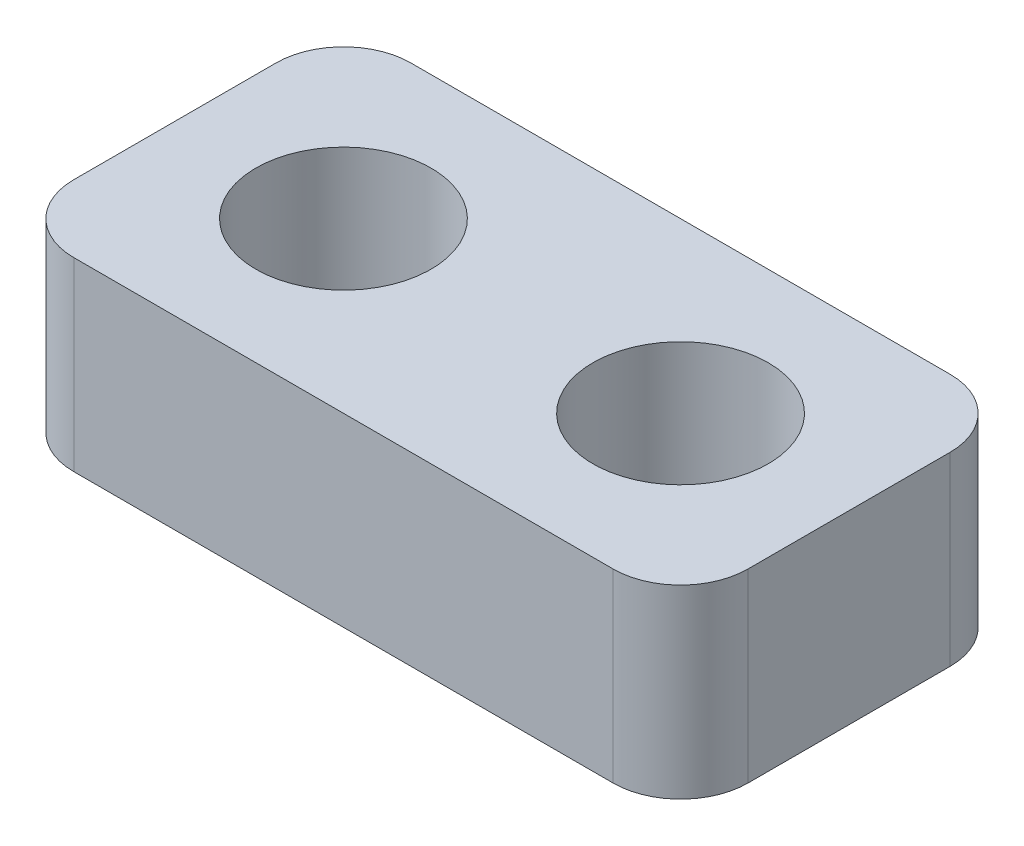
ISO-10303-21;
HEADER;
FILE_DESCRIPTION(('STEP AP214'),'2;1');
FILE_NAME('part.step','',(''),(''),'','','');
FILE_SCHEMA(('AUTOMOTIVE_DESIGN { 1 0 10303 214 1 1 1 1 }'));
ENDSEC;
DATA;
#1=APPLICATION_CONTEXT('core data for automotive mechanical design processes');
#2=APPLICATION_PROTOCOL_DEFINITION('international standard','automotive_design',2000,#1);
#3=PRODUCT_CONTEXT('',#1,'mechanical');
#4=PRODUCT('Part','Part','',(#3));
#5=PRODUCT_RELATED_PRODUCT_CATEGORY('part','',(#4));
#6=PRODUCT_DEFINITION_FORMATION('','',#4);
#7=PRODUCT_DEFINITION_CONTEXT('part definition',#1,'design');
#8=PRODUCT_DEFINITION('design','',#6,#7);
#9=PRODUCT_DEFINITION_SHAPE('','',#8);
#10=(LENGTH_UNIT() NAMED_UNIT(*) SI_UNIT(.MILLI.,.METRE.));
#11=(NAMED_UNIT(*) PLANE_ANGLE_UNIT() SI_UNIT($,.RADIAN.));
#12=(NAMED_UNIT(*) SI_UNIT($,.STERADIAN.) SOLID_ANGLE_UNIT());
#13=UNCERTAINTY_MEASURE_WITH_UNIT(LENGTH_MEASURE(1.E-05),#10,'distance_accuracy_value','');
#14=(GEOMETRIC_REPRESENTATION_CONTEXT(3) GLOBAL_UNCERTAINTY_ASSIGNED_CONTEXT((#13)) GLOBAL_UNIT_ASSIGNED_CONTEXT((#10,
#11,#12)) REPRESENTATION_CONTEXT('',''));
#15=CARTESIAN_POINT('',(0.,0.,0.));
#16=DIRECTION('',(0.,0.,1.));
#17=DIRECTION('',(1.,0.,0.));
#18=AXIS2_PLACEMENT_3D('',#15,#16,#17);
#19=CARTESIAN_POINT('',(0.,5.5,0.));
#20=DIRECTION('',(0.,-1.,0.));
#21=DIRECTION('',(0.,0.,-1.));
#22=AXIS2_PLACEMENT_3D('',#19,#20,#21);
#23=PLANE('',#22);
#24=DIRECTION('',(-1.,0.,0.));
#25=VECTOR('',#24,1.);
#26=CARTESIAN_POINT('',(0.,5.5,-10.));
#27=LINE('',#26,#25);
#28=CARTESIAN_POINT('',(18.,5.5,-10.));
#29=VERTEX_POINT('',#28);
#30=CARTESIAN_POINT('',(2.,5.5,-10.));
#31=VERTEX_POINT('',#30);
#32=EDGE_CURVE('E156',#29,#31,#27,.T.);
#33=ORIENTED_EDGE('',*,*,#32,.T.);
#34=CARTESIAN_POINT('',(2.,5.5,-8.));
#35=DIRECTION('',(0.,-1.,0.));
#36=DIRECTION('',(0.,0.,-1.));
#37=AXIS2_PLACEMENT_3D('',#34,#35,#36);
#38=CIRCLE('',#37,2.);
#39=CARTESIAN_POINT('',(0.,5.5,-8.));
#40=VERTEX_POINT('',#39);
#41=EDGE_CURVE('E185',#31,#40,#38,.F.);
#42=ORIENTED_EDGE('',*,*,#41,.T.);
#43=DIRECTION('',(0.,0.,1.));
#44=VECTOR('',#43,1.);
#45=CARTESIAN_POINT('',(0.,5.5,0.));
#46=LINE('',#45,#44);
#47=CARTESIAN_POINT('',(0.,5.5,-2.));
#48=VERTEX_POINT('',#47);
#49=EDGE_CURVE('E134',#40,#48,#46,.T.);
#50=ORIENTED_EDGE('',*,*,#49,.T.);
#51=CARTESIAN_POINT('',(2.,5.5,-2.));
#52=DIRECTION('',(0.,-1.,0.));
#53=DIRECTION('',(0.,0.,-1.));
#54=AXIS2_PLACEMENT_3D('',#51,#52,#53);
#55=CIRCLE('',#54,2.);
#56=CARTESIAN_POINT('',(2.,5.5,0.));
#57=VERTEX_POINT('',#56);
#58=EDGE_CURVE('E179',#48,#57,#55,.F.);
#59=ORIENTED_EDGE('',*,*,#58,.T.);
#60=DIRECTION('',(1.,0.,0.));
#61=VECTOR('',#60,1.);
#62=CARTESIAN_POINT('',(0.,5.5,0.));
#63=LINE('',#62,#61);
#64=CARTESIAN_POINT('',(18.,5.5,0.));
#65=VERTEX_POINT('',#64);
#66=EDGE_CURVE('E198',#57,#65,#63,.T.);
#67=ORIENTED_EDGE('',*,*,#66,.T.);
#68=CARTESIAN_POINT('',(18.,5.5,-2.));
#69=DIRECTION('',(0.,-1.,0.));
#70=DIRECTION('',(0.,0.,-1.));
#71=AXIS2_PLACEMENT_3D('',#68,#69,#70);
#72=CIRCLE('',#71,2.);
#73=CARTESIAN_POINT('',(20.,5.5,-2.));
#74=VERTEX_POINT('',#73);
#75=EDGE_CURVE('E68',#65,#74,#72,.F.);
#76=ORIENTED_EDGE('',*,*,#75,.T.);
#77=DIRECTION('',(0.,0.,-1.));
#78=VECTOR('',#77,1.);
#79=CARTESIAN_POINT('',(20.,5.5,0.));
#80=LINE('',#79,#78);
#81=CARTESIAN_POINT('',(20.,5.5,-8.));
#82=VERTEX_POINT('',#81);
#83=EDGE_CURVE('E205',#74,#82,#80,.T.);
#84=ORIENTED_EDGE('',*,*,#83,.T.);
#85=CARTESIAN_POINT('',(18.,5.5,-8.));
#86=DIRECTION('',(0.,-1.,0.));
#87=DIRECTION('',(0.,0.,-1.));
#88=AXIS2_PLACEMENT_3D('',#85,#86,#87);
#89=CIRCLE('',#88,2.);
#90=EDGE_CURVE('E182',#82,#29,#89,.F.);
#91=ORIENTED_EDGE('',*,*,#90,.T.);
#92=EDGE_LOOP('',(#33,#42,#50,#59,#67,#76,#84,#91));
#93=FACE_BOUND('',#92,.T.);
#94=CARTESIAN_POINT('',(5.,5.5,-5.));
#95=DIRECTION('',(0.,1.,0.));
#96=DIRECTION('',(0.,0.,1.));
#97=AXIS2_PLACEMENT_3D('',#94,#95,#96);
#98=CIRCLE('',#97,2.6);
#99=CARTESIAN_POINT('',(5.,5.5,-2.4));
#100=VERTEX_POINT('',#99);
#101=EDGE_CURVE('E145',#100,#100,#98,.T.);
#102=ORIENTED_EDGE('',*,*,#101,.F.);
#103=EDGE_LOOP('',(#102));
#104=FACE_BOUND('',#103,.T.);
#105=CARTESIAN_POINT('',(15.,5.5,-5.));
#106=DIRECTION('',(0.,1.,0.));
#107=DIRECTION('',(0.,0.,-1.));
#108=AXIS2_PLACEMENT_3D('',#105,#106,#107);
#109=CIRCLE('',#108,2.6);
#110=CARTESIAN_POINT('',(15.,5.5,-7.6));
#111=VERTEX_POINT('',#110);
#112=EDGE_CURVE('E224',#111,#111,#109,.T.);
#113=ORIENTED_EDGE('',*,*,#112,.F.);
#114=EDGE_LOOP('',(#113));
#115=FACE_BOUND('',#114,.T.);
#116=ADVANCED_FACE('F45',(#93,#104,#115),#23,.F.);
#117=CARTESIAN_POINT('',(0.,0.,0.));
#118=DIRECTION('',(0.,-1.,0.));
#119=DIRECTION('',(0.,0.,-1.));
#120=AXIS2_PLACEMENT_3D('',#117,#118,#119);
#121=PLANE('',#120);
#122=CARTESIAN_POINT('',(5.,0.,-5.));
#123=DIRECTION('',(0.,1.,0.));
#124=DIRECTION('',(0.,0.,1.));
#125=AXIS2_PLACEMENT_3D('',#122,#123,#124);
#126=CIRCLE('',#125,2.6);
#127=CARTESIAN_POINT('',(5.,0.,-2.4));
#128=VERTEX_POINT('',#127);
#129=EDGE_CURVE('E153',#128,#128,#126,.T.);
#130=ORIENTED_EDGE('',*,*,#129,.T.);
#131=EDGE_LOOP('',(#130));
#132=FACE_BOUND('',#131,.T.);
#133=DIRECTION('',(0.,0.,1.));
#134=VECTOR('',#133,1.);
#135=CARTESIAN_POINT('',(0.,0.,0.));
#136=LINE('',#135,#134);
#137=CARTESIAN_POINT('',(0.,0.,-8.));
#138=VERTEX_POINT('',#137);
#139=CARTESIAN_POINT('',(0.,0.,-2.));
#140=VERTEX_POINT('',#139);
#141=EDGE_CURVE('E131',#138,#140,#136,.T.);
#142=ORIENTED_EDGE('',*,*,#141,.F.);
#143=CARTESIAN_POINT('',(2.,0.,-8.));
#144=DIRECTION('',(0.,-1.,0.));
#145=DIRECTION('',(0.,0.,-1.));
#146=AXIS2_PLACEMENT_3D('',#143,#144,#145);
#147=CIRCLE('',#146,2.);
#148=CARTESIAN_POINT('',(2.,0.,-10.));
#149=VERTEX_POINT('',#148);
#150=EDGE_CURVE('E113',#138,#149,#147,.T.);
#151=ORIENTED_EDGE('',*,*,#150,.T.);
#152=DIRECTION('',(-1.,0.,0.));
#153=VECTOR('',#152,1.);
#154=CARTESIAN_POINT('',(0.,0.,-10.));
#155=LINE('',#154,#153);
#156=CARTESIAN_POINT('',(18.,0.,-10.));
#157=VERTEX_POINT('',#156);
#158=EDGE_CURVE('E161',#157,#149,#155,.T.);
#159=ORIENTED_EDGE('',*,*,#158,.F.);
#160=CARTESIAN_POINT('',(18.,0.,-8.));
#161=DIRECTION('',(0.,-1.,0.));
#162=DIRECTION('',(0.,0.,-1.));
#163=AXIS2_PLACEMENT_3D('',#160,#161,#162);
#164=CIRCLE('',#163,2.);
#165=CARTESIAN_POINT('',(20.,0.,-8.));
#166=VERTEX_POINT('',#165);
#167=EDGE_CURVE('E125',#157,#166,#164,.T.);
#168=ORIENTED_EDGE('',*,*,#167,.T.);
#169=DIRECTION('',(0.,0.,-1.));
#170=VECTOR('',#169,1.);
#171=CARTESIAN_POINT('',(20.,0.,0.));
#172=LINE('',#171,#170);
#173=CARTESIAN_POINT('',(20.,0.,-2.));
#174=VERTEX_POINT('',#173);
#175=EDGE_CURVE('E150',#174,#166,#172,.T.);
#176=ORIENTED_EDGE('',*,*,#175,.F.);
#177=CARTESIAN_POINT('',(18.,0.,-2.));
#178=DIRECTION('',(0.,-1.,0.));
#179=DIRECTION('',(0.,0.,-1.));
#180=AXIS2_PLACEMENT_3D('',#177,#178,#179);
#181=CIRCLE('',#180,2.);
#182=CARTESIAN_POINT('',(18.,0.,0.));
#183=VERTEX_POINT('',#182);
#184=EDGE_CURVE('E136',#174,#183,#181,.T.);
#185=ORIENTED_EDGE('',*,*,#184,.T.);
#186=DIRECTION('',(1.,0.,0.));
#187=VECTOR('',#186,1.);
#188=CARTESIAN_POINT('',(0.,0.,0.));
#189=LINE('',#188,#187);
#190=CARTESIAN_POINT('',(2.,0.,0.));
#191=VERTEX_POINT('',#190);
#192=EDGE_CURVE('E144',#191,#183,#189,.T.);
#193=ORIENTED_EDGE('',*,*,#192,.F.);
#194=CARTESIAN_POINT('',(2.,0.,-2.));
#195=DIRECTION('',(0.,-1.,0.));
#196=DIRECTION('',(0.,0.,-1.));
#197=AXIS2_PLACEMENT_3D('',#194,#195,#196);
#198=CIRCLE('',#197,2.);
#199=EDGE_CURVE('E142',#191,#140,#198,.T.);
#200=ORIENTED_EDGE('',*,*,#199,.T.);
#201=EDGE_LOOP('',(#142,#151,#159,#168,#176,#185,#193,#200));
#202=FACE_BOUND('',#201,.T.);
#203=CARTESIAN_POINT('',(15.,0.,-5.));
#204=DIRECTION('',(0.,1.,0.));
#205=DIRECTION('',(0.,0.,-1.));
#206=AXIS2_PLACEMENT_3D('',#203,#204,#205);
#207=CIRCLE('',#206,2.6);
#208=CARTESIAN_POINT('',(15.,0.,-7.6));
#209=VERTEX_POINT('',#208);
#210=EDGE_CURVE('E226',#209,#209,#207,.T.);
#211=ORIENTED_EDGE('',*,*,#210,.T.);
#212=EDGE_LOOP('',(#211));
#213=FACE_BOUND('',#212,.T.);
#214=ADVANCED_FACE('F139',(#132,#202,#213),#121,.T.);
#215=CARTESIAN_POINT('',(0.,5.5,0.));
#216=DIRECTION('',(1.,0.,0.));
#217=DIRECTION('',(0.,0.,-1.));
#218=AXIS2_PLACEMENT_3D('',#215,#216,#217);
#219=PLANE('',#218);
#220=ORIENTED_EDGE('',*,*,#49,.F.);
#221=DIRECTION('',(0.,-1.,0.));
#222=VECTOR('',#221,1.);
#223=CARTESIAN_POINT('',(0.,5.5,-8.));
#224=LINE('',#223,#222);
#225=EDGE_CURVE('E117',#40,#138,#224,.T.);
#226=ORIENTED_EDGE('',*,*,#225,.T.);
#227=ORIENTED_EDGE('',*,*,#141,.T.);
#228=DIRECTION('',(0.,-1.,0.));
#229=VECTOR('',#228,1.);
#230=CARTESIAN_POINT('',(0.,5.5,-2.));
#231=LINE('',#230,#229);
#232=EDGE_CURVE('E137',#140,#48,#231,.F.);
#233=ORIENTED_EDGE('',*,*,#232,.T.);
#234=EDGE_LOOP('',(#220,#226,#227,#233));
#235=FACE_BOUND('',#234,.T.);
#236=ADVANCED_FACE('F130',(#235),#219,.F.);
#237=CARTESIAN_POINT('',(0.,5.5,0.));
#238=DIRECTION('',(0.,0.,-1.));
#239=DIRECTION('',(-1.,0.,0.));
#240=AXIS2_PLACEMENT_3D('',#237,#238,#239);
#241=PLANE('',#240);
#242=ORIENTED_EDGE('',*,*,#66,.F.);
#243=DIRECTION('',(0.,-1.,0.));
#244=VECTOR('',#243,1.);
#245=CARTESIAN_POINT('',(2.,5.5,0.));
#246=LINE('',#245,#244);
#247=EDGE_CURVE('E11',#57,#191,#246,.T.);
#248=ORIENTED_EDGE('',*,*,#247,.T.);
#249=ORIENTED_EDGE('',*,*,#192,.T.);
#250=DIRECTION('',(0.,-1.,0.));
#251=VECTOR('',#250,1.);
#252=CARTESIAN_POINT('',(18.,5.5,0.));
#253=LINE('',#252,#251);
#254=EDGE_CURVE('E54',#183,#65,#253,.F.);
#255=ORIENTED_EDGE('',*,*,#254,.T.);
#256=EDGE_LOOP('',(#242,#248,#249,#255));
#257=FACE_BOUND('',#256,.T.);
#258=ADVANCED_FACE('F197',(#257),#241,.F.);
#259=CARTESIAN_POINT('',(20.,5.5,0.));
#260=DIRECTION('',(-1.,0.,0.));
#261=DIRECTION('',(0.,0.,1.));
#262=AXIS2_PLACEMENT_3D('',#259,#260,#261);
#263=PLANE('',#262);
#264=ORIENTED_EDGE('',*,*,#175,.T.);
#265=DIRECTION('',(0.,-1.,0.));
#266=VECTOR('',#265,1.);
#267=CARTESIAN_POINT('',(20.,5.5,-8.));
#268=LINE('',#267,#266);
#269=EDGE_CURVE('E61',#166,#82,#268,.F.);
#270=ORIENTED_EDGE('',*,*,#269,.T.);
#271=ORIENTED_EDGE('',*,*,#83,.F.);
#272=DIRECTION('',(0.,-1.,0.));
#273=VECTOR('',#272,1.);
#274=CARTESIAN_POINT('',(20.,5.5,-2.));
#275=LINE('',#274,#273);
#276=EDGE_CURVE('E188',#74,#174,#275,.T.);
#277=ORIENTED_EDGE('',*,*,#276,.T.);
#278=EDGE_LOOP('',(#264,#270,#271,#277));
#279=FACE_BOUND('',#278,.T.);
#280=ADVANCED_FACE('F209',(#279),#263,.F.);
#281=CARTESIAN_POINT('',(0.,5.5,-10.));
#282=DIRECTION('',(0.,0.,1.));
#283=DIRECTION('',(1.,0.,0.));
#284=AXIS2_PLACEMENT_3D('',#281,#282,#283);
#285=PLANE('',#284);
#286=ORIENTED_EDGE('',*,*,#158,.T.);
#287=DIRECTION('',(0.,-1.,0.));
#288=VECTOR('',#287,1.);
#289=CARTESIAN_POINT('',(2.,5.5,-10.));
#290=LINE('',#289,#288);
#291=EDGE_CURVE('E118',#149,#31,#290,.F.);
#292=ORIENTED_EDGE('',*,*,#291,.T.);
#293=ORIENTED_EDGE('',*,*,#32,.F.);
#294=DIRECTION('',(0.,-1.,0.));
#295=VECTOR('',#294,1.);
#296=CARTESIAN_POINT('',(18.,5.5,-10.));
#297=LINE('',#296,#295);
#298=EDGE_CURVE('E124',#29,#157,#297,.T.);
#299=ORIENTED_EDGE('',*,*,#298,.T.);
#300=EDGE_LOOP('',(#286,#292,#293,#299));
#301=FACE_BOUND('',#300,.T.);
#302=ADVANCED_FACE('F216',(#301),#285,.F.);
#303=CARTESIAN_POINT('',(5.,5.5,-5.));
#304=DIRECTION('',(0.,-1.,0.));
#305=DIRECTION('',(0.,0.,-1.));
#306=AXIS2_PLACEMENT_3D('',#303,#304,#305);
#307=CYLINDRICAL_SURFACE('',#306,2.6);
#308=ORIENTED_EDGE('',*,*,#101,.T.);
#309=EDGE_LOOP('',(#308));
#310=FACE_BOUND('',#309,.T.);
#311=ORIENTED_EDGE('',*,*,#129,.F.);
#312=EDGE_LOOP('',(#311));
#313=FACE_BOUND('',#312,.T.);
#314=ADVANCED_FACE('F246',(#310,#313),#307,.F.);
#315=CARTESIAN_POINT('',(15.,5.5,-5.));
#316=DIRECTION('',(0.,-1.,0.));
#317=DIRECTION('',(0.,0.,-1.));
#318=AXIS2_PLACEMENT_3D('',#315,#316,#317);
#319=CYLINDRICAL_SURFACE('',#318,2.6);
#320=ORIENTED_EDGE('',*,*,#112,.T.);
#321=EDGE_LOOP('',(#320));
#322=FACE_BOUND('',#321,.T.);
#323=ORIENTED_EDGE('',*,*,#210,.F.);
#324=EDGE_LOOP('',(#323));
#325=FACE_BOUND('',#324,.T.);
#326=ADVANCED_FACE('F234',(#322,#325),#319,.F.);
#327=CARTESIAN_POINT('',(2.,5.5,-8.));
#328=DIRECTION('',(0.,-1.,0.));
#329=DIRECTION('',(0.,0.,-1.));
#330=AXIS2_PLACEMENT_3D('',#327,#328,#329);
#331=CYLINDRICAL_SURFACE('',#330,2.);
#332=ORIENTED_EDGE('',*,*,#41,.F.);
#333=ORIENTED_EDGE('',*,*,#291,.F.);
#334=ORIENTED_EDGE('',*,*,#150,.F.);
#335=ORIENTED_EDGE('',*,*,#225,.F.);
#336=EDGE_LOOP('',(#332,#333,#334,#335));
#337=FACE_BOUND('',#336,.T.);
#338=ADVANCED_FACE('F116',(#337),#331,.T.);
#339=CARTESIAN_POINT('',(18.,5.5,-8.));
#340=DIRECTION('',(0.,-1.,0.));
#341=DIRECTION('',(0.,0.,-1.));
#342=AXIS2_PLACEMENT_3D('',#339,#340,#341);
#343=CYLINDRICAL_SURFACE('',#342,2.);
#344=ORIENTED_EDGE('',*,*,#90,.F.);
#345=ORIENTED_EDGE('',*,*,#269,.F.);
#346=ORIENTED_EDGE('',*,*,#167,.F.);
#347=ORIENTED_EDGE('',*,*,#298,.F.);
#348=EDGE_LOOP('',(#344,#345,#346,#347));
#349=FACE_BOUND('',#348,.T.);
#350=ADVANCED_FACE('F213',(#349),#343,.T.);
#351=CARTESIAN_POINT('',(2.,5.5,-2.));
#352=DIRECTION('',(0.,-1.,0.));
#353=DIRECTION('',(0.,0.,-1.));
#354=AXIS2_PLACEMENT_3D('',#351,#352,#353);
#355=CYLINDRICAL_SURFACE('',#354,2.);
#356=ORIENTED_EDGE('',*,*,#58,.F.);
#357=ORIENTED_EDGE('',*,*,#232,.F.);
#358=ORIENTED_EDGE('',*,*,#199,.F.);
#359=ORIENTED_EDGE('',*,*,#247,.F.);
#360=EDGE_LOOP('',(#356,#357,#358,#359));
#361=FACE_BOUND('',#360,.T.);
#362=ADVANCED_FACE('F260',(#361),#355,.T.);
#363=CARTESIAN_POINT('',(18.,5.5,-2.));
#364=DIRECTION('',(0.,-1.,0.));
#365=DIRECTION('',(0.,0.,-1.));
#366=AXIS2_PLACEMENT_3D('',#363,#364,#365);
#367=CYLINDRICAL_SURFACE('',#366,2.);
#368=ORIENTED_EDGE('',*,*,#75,.F.);
#369=ORIENTED_EDGE('',*,*,#254,.F.);
#370=ORIENTED_EDGE('',*,*,#184,.F.);
#371=ORIENTED_EDGE('',*,*,#276,.F.);
#372=EDGE_LOOP('',(#368,#369,#370,#371));
#373=FACE_BOUND('',#372,.T.);
#374=ADVANCED_FACE('F47',(#373),#367,.T.);
#375=CLOSED_SHELL('',(#116,#214,#236,#258,#280,#302,#314,#326,#338,#350,#362,#374));
#376=MANIFOLD_SOLID_BREP('B2',#375);
#377=ADVANCED_BREP_SHAPE_REPRESENTATION('',(#18,#376),#14);
#378=SHAPE_DEFINITION_REPRESENTATION(#9,#377);
ENDSEC;
END-ISO-10303-21;
